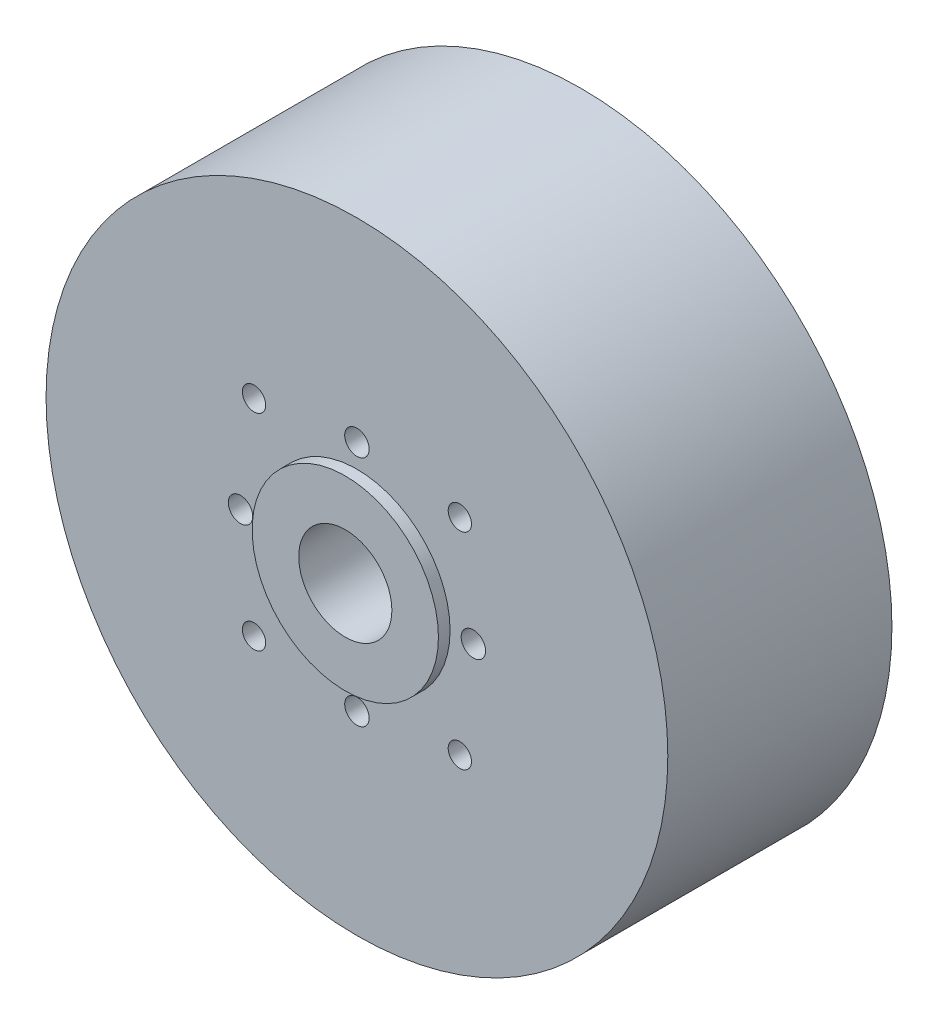
ISO-10303-21;
HEADER;
FILE_DESCRIPTION(('STEP AP214'),'2;1');
FILE_NAME('part.step','',(''),(''),'','','');
FILE_SCHEMA(('AUTOMOTIVE_DESIGN { 1 0 10303 214 1 1 1 1 }'));
ENDSEC;
DATA;
#1=APPLICATION_CONTEXT('core data for automotive mechanical design processes');
#2=APPLICATION_PROTOCOL_DEFINITION('international standard','automotive_design',2000,#1);
#3=PRODUCT_CONTEXT('',#1,'mechanical');
#4=PRODUCT('Part','Part','',(#3));
#5=PRODUCT_RELATED_PRODUCT_CATEGORY('part','',(#4));
#6=PRODUCT_DEFINITION_FORMATION('','',#4);
#7=PRODUCT_DEFINITION_CONTEXT('part definition',#1,'design');
#8=PRODUCT_DEFINITION('design','',#6,#7);
#9=PRODUCT_DEFINITION_SHAPE('','',#8);
#10=(LENGTH_UNIT() NAMED_UNIT(*) SI_UNIT(.MILLI.,.METRE.));
#11=(NAMED_UNIT(*) PLANE_ANGLE_UNIT() SI_UNIT($,.RADIAN.));
#12=(NAMED_UNIT(*) SI_UNIT($,.STERADIAN.) SOLID_ANGLE_UNIT());
#13=UNCERTAINTY_MEASURE_WITH_UNIT(LENGTH_MEASURE(1.E-05),#10,'distance_accuracy_value','');
#14=(GEOMETRIC_REPRESENTATION_CONTEXT(3) GLOBAL_UNCERTAINTY_ASSIGNED_CONTEXT((#13)) GLOBAL_UNIT_ASSIGNED_CONTEXT((#10,
#11,#12)) REPRESENTATION_CONTEXT('',''));
#15=CARTESIAN_POINT('',(0.,0.,0.));
#16=DIRECTION('',(0.,0.,1.));
#17=DIRECTION('',(1.,0.,0.));
#18=AXIS2_PLACEMENT_3D('',#15,#16,#17);
#19=CARTESIAN_POINT('',(0.,0.,0.));
#20=DIRECTION('',(0.,0.,1.));
#21=DIRECTION('',(1.,0.,0.));
#22=AXIS2_PLACEMENT_3D('',#19,#20,#21);
#23=PLANE('',#22);
#24=CARTESIAN_POINT('',(0.,-20.,0.));
#25=DIRECTION('',(0.,0.,1.));
#26=DIRECTION('',(1.,0.,0.));
#27=AXIS2_PLACEMENT_3D('',#24,#25,#26);
#28=CIRCLE('',#27,2.1);
#29=CARTESIAN_POINT('',(2.1,-20.,0.));
#30=VERTEX_POINT('',#29);
#31=EDGE_CURVE('E100',#30,#30,#28,.T.);
#32=ORIENTED_EDGE('',*,*,#31,.F.);
#33=EDGE_LOOP('',(#32));
#34=FACE_BOUND('',#33,.T.);
#35=CARTESIAN_POINT('',(20.,0.,0.));
#36=DIRECTION('',(0.,0.,1.));
#37=DIRECTION('',(1.,0.,0.));
#38=AXIS2_PLACEMENT_3D('',#35,#36,#37);
#39=CIRCLE('',#38,2.1);
#40=CARTESIAN_POINT('',(22.1,0.,0.));
#41=VERTEX_POINT('',#40);
#42=EDGE_CURVE('E97',#41,#41,#39,.T.);
#43=ORIENTED_EDGE('',*,*,#42,.F.);
#44=EDGE_LOOP('',(#43));
#45=FACE_BOUND('',#44,.T.);
#46=CARTESIAN_POINT('',(0.,20.,0.));
#47=DIRECTION('',(0.,0.,1.));
#48=DIRECTION('',(1.,0.,0.));
#49=AXIS2_PLACEMENT_3D('',#46,#47,#48);
#50=CIRCLE('',#49,2.1);
#51=CARTESIAN_POINT('',(2.1,20.,0.));
#52=VERTEX_POINT('',#51);
#53=EDGE_CURVE('E91',#52,#52,#50,.T.);
#54=ORIENTED_EDGE('',*,*,#53,.F.);
#55=EDGE_LOOP('',(#54));
#56=FACE_BOUND('',#55,.T.);
#57=CARTESIAN_POINT('',(-20.,0.,0.));
#58=DIRECTION('',(0.,0.,1.));
#59=DIRECTION('',(1.,0.,0.));
#60=AXIS2_PLACEMENT_3D('',#57,#58,#59);
#61=CIRCLE('',#60,2.1);
#62=CARTESIAN_POINT('',(-17.9,0.,0.));
#63=VERTEX_POINT('',#62);
#64=EDGE_CURVE('E84',#63,#63,#61,.T.);
#65=ORIENTED_EDGE('',*,*,#64,.F.);
#66=EDGE_LOOP('',(#65));
#67=FACE_BOUND('',#66,.T.);
#68=CARTESIAN_POINT('',(0.,0.,0.));
#69=DIRECTION('',(0.,0.,1.));
#70=DIRECTION('',(1.,0.,0.));
#71=AXIS2_PLACEMENT_3D('',#68,#69,#70);
#72=CIRCLE('',#71,53.4);
#73=CARTESIAN_POINT('',(53.4,0.,0.));
#74=VERTEX_POINT('',#73);
#75=EDGE_CURVE('E36',#74,#74,#72,.T.);
#76=ORIENTED_EDGE('',*,*,#75,.T.);
#77=EDGE_LOOP('',(#76));
#78=FACE_BOUND('',#77,.T.);
#79=CARTESIAN_POINT('',(17.6776695296637,-17.6776695296637,0.));
#80=DIRECTION('',(0.,0.,1.));
#81=DIRECTION('',(1.,0.,0.));
#82=AXIS2_PLACEMENT_3D('',#79,#80,#81);
#83=CIRCLE('',#82,2.);
#84=CARTESIAN_POINT('',(19.6776695296637,-17.6776695296637,0.));
#85=VERTEX_POINT('',#84);
#86=EDGE_CURVE('E48',#85,#85,#83,.T.);
#87=ORIENTED_EDGE('',*,*,#86,.F.);
#88=EDGE_LOOP('',(#87));
#89=FACE_BOUND('',#88,.T.);
#90=CARTESIAN_POINT('',(17.6776695296637,17.6776695296637,0.));
#91=DIRECTION('',(0.,0.,1.));
#92=DIRECTION('',(1.,0.,0.));
#93=AXIS2_PLACEMENT_3D('',#90,#91,#92);
#94=CIRCLE('',#93,2.);
#95=CARTESIAN_POINT('',(19.6776695296637,17.6776695296637,0.));
#96=VERTEX_POINT('',#95);
#97=EDGE_CURVE('E51',#96,#96,#94,.T.);
#98=ORIENTED_EDGE('',*,*,#97,.F.);
#99=EDGE_LOOP('',(#98));
#100=FACE_BOUND('',#99,.T.);
#101=CARTESIAN_POINT('',(-17.6776695296638,17.6776695296636,0.));
#102=DIRECTION('',(0.,0.,1.));
#103=DIRECTION('',(1.,0.,0.));
#104=AXIS2_PLACEMENT_3D('',#101,#102,#103);
#105=CIRCLE('',#104,2.00000000000001);
#106=CARTESIAN_POINT('',(-15.6776695296638,17.6776695296636,0.));
#107=VERTEX_POINT('',#106);
#108=EDGE_CURVE('E64',#107,#107,#105,.T.);
#109=ORIENTED_EDGE('',*,*,#108,.F.);
#110=EDGE_LOOP('',(#109));
#111=FACE_BOUND('',#110,.T.);
#112=CARTESIAN_POINT('',(-17.6776695296636,-17.6776695296638,0.));
#113=DIRECTION('',(0.,0.,1.));
#114=DIRECTION('',(1.,0.,0.));
#115=AXIS2_PLACEMENT_3D('',#112,#113,#114);
#116=CIRCLE('',#115,1.99999999999999);
#117=CARTESIAN_POINT('',(-15.6776695296636,-17.6776695296638,0.));
#118=VERTEX_POINT('',#117);
#119=EDGE_CURVE('E57',#118,#118,#116,.T.);
#120=ORIENTED_EDGE('',*,*,#119,.F.);
#121=EDGE_LOOP('',(#120));
#122=FACE_BOUND('',#121,.T.);
#123=CARTESIAN_POINT('',(0.,0.,0.));
#124=DIRECTION('',(0.,0.,1.));
#125=DIRECTION('',(1.,0.,0.));
#126=AXIS2_PLACEMENT_3D('',#123,#124,#125);
#127=CIRCLE('',#126,16.);
#128=CARTESIAN_POINT('',(16.,0.,0.));
#129=VERTEX_POINT('',#128);
#130=EDGE_CURVE('E72',#129,#129,#127,.T.);
#131=ORIENTED_EDGE('',*,*,#130,.F.);
#132=EDGE_LOOP('',(#131));
#133=FACE_BOUND('',#132,.T.);
#134=ADVANCED_FACE('F32',(#34,#45,#56,#67,#78,#89,#100,#111,#122,#133),#23,.T.);
#135=CARTESIAN_POINT('',(0.,0.,-38.5));
#136=DIRECTION('',(0.,0.,1.));
#137=DIRECTION('',(1.,0.,0.));
#138=AXIS2_PLACEMENT_3D('',#135,#136,#137);
#139=CYLINDRICAL_SURFACE('',#138,53.4);
#140=CARTESIAN_POINT('',(0.,0.,-38.5));
#141=DIRECTION('',(0.,0.,1.));
#142=DIRECTION('',(1.,0.,0.));
#143=AXIS2_PLACEMENT_3D('',#140,#141,#142);
#144=CIRCLE('',#143,53.4);
#145=CARTESIAN_POINT('',(53.4,0.,-38.5));
#146=VERTEX_POINT('',#145);
#147=EDGE_CURVE('E10',#146,#146,#144,.T.);
#148=ORIENTED_EDGE('',*,*,#147,.T.);
#149=EDGE_LOOP('',(#148));
#150=FACE_BOUND('',#149,.T.);
#151=ORIENTED_EDGE('',*,*,#75,.F.);
#152=EDGE_LOOP('',(#151));
#153=FACE_BOUND('',#152,.T.);
#154=ADVANCED_FACE('F34',(#150,#153),#139,.T.);
#155=CARTESIAN_POINT('',(0.,0.,-38.5));
#156=DIRECTION('',(0.,0.,1.));
#157=DIRECTION('',(1.,0.,0.));
#158=AXIS2_PLACEMENT_3D('',#155,#156,#157);
#159=PLANE('',#158);
#160=CARTESIAN_POINT('',(30.,0.,-38.5));
#161=DIRECTION('',(0.,0.,-1.));
#162=DIRECTION('',(-1.,0.,0.));
#163=AXIS2_PLACEMENT_3D('',#160,#161,#162);
#164=CIRCLE('',#163,2.5);
#165=CARTESIAN_POINT('',(27.5,0.,-38.5));
#166=VERTEX_POINT('',#165);
#167=EDGE_CURVE('E123',#166,#166,#164,.T.);
#168=ORIENTED_EDGE('',*,*,#167,.F.);
#169=EDGE_LOOP('',(#168));
#170=FACE_BOUND('',#169,.T.);
#171=CARTESIAN_POINT('',(0.,30.,-38.5));
#172=DIRECTION('',(0.,0.,-1.));
#173=DIRECTION('',(-1.,0.,0.));
#174=AXIS2_PLACEMENT_3D('',#171,#172,#173);
#175=CIRCLE('',#174,2.5);
#176=CARTESIAN_POINT('',(-2.5,30.,-38.5));
#177=VERTEX_POINT('',#176);
#178=EDGE_CURVE('E120',#177,#177,#175,.T.);
#179=ORIENTED_EDGE('',*,*,#178,.F.);
#180=EDGE_LOOP('',(#179));
#181=FACE_BOUND('',#180,.T.);
#182=CARTESIAN_POINT('',(-30.,0.,-38.5));
#183=DIRECTION('',(0.,0.,-1.));
#184=DIRECTION('',(-1.,0.,0.));
#185=AXIS2_PLACEMENT_3D('',#182,#183,#184);
#186=CIRCLE('',#185,2.5);
#187=CARTESIAN_POINT('',(-32.5,0.,-38.5));
#188=VERTEX_POINT('',#187);
#189=EDGE_CURVE('E114',#188,#188,#186,.T.);
#190=ORIENTED_EDGE('',*,*,#189,.F.);
#191=EDGE_LOOP('',(#190));
#192=FACE_BOUND('',#191,.T.);
#193=CARTESIAN_POINT('',(0.,-30.,-38.5));
#194=DIRECTION('',(0.,0.,-1.));
#195=DIRECTION('',(-1.,0.,0.));
#196=AXIS2_PLACEMENT_3D('',#193,#194,#195);
#197=CIRCLE('',#196,2.5);
#198=CARTESIAN_POINT('',(-2.5,-30.,-38.5));
#199=VERTEX_POINT('',#198);
#200=EDGE_CURVE('E108',#199,#199,#197,.T.);
#201=ORIENTED_EDGE('',*,*,#200,.F.);
#202=EDGE_LOOP('',(#201));
#203=FACE_BOUND('',#202,.T.);
#204=CARTESIAN_POINT('',(0.,0.,-38.5));
#205=DIRECTION('',(0.,0.,1.));
#206=DIRECTION('',(1.,0.,0.));
#207=AXIS2_PLACEMENT_3D('',#204,#205,#206);
#208=CIRCLE('',#207,8.);
#209=CARTESIAN_POINT('',(8.,0.,-38.5));
#210=VERTEX_POINT('',#209);
#211=EDGE_CURVE('E43',#210,#210,#208,.T.);
#212=ORIENTED_EDGE('',*,*,#211,.T.);
#213=EDGE_LOOP('',(#212));
#214=FACE_BOUND('',#213,.T.);
#215=ORIENTED_EDGE('',*,*,#147,.F.);
#216=EDGE_LOOP('',(#215));
#217=FACE_BOUND('',#216,.T.);
#218=ADVANCED_FACE('F138',(#170,#181,#192,#203,#214,#217),#159,.F.);
#219=CARTESIAN_POINT('',(0.,0.,-38.5));
#220=DIRECTION('',(0.,0.,1.));
#221=DIRECTION('',(1.,0.,0.));
#222=AXIS2_PLACEMENT_3D('',#219,#220,#221);
#223=CYLINDRICAL_SURFACE('',#222,8.);
#224=ORIENTED_EDGE('',*,*,#211,.F.);
#225=EDGE_LOOP('',(#224));
#226=FACE_BOUND('',#225,.T.);
#227=CARTESIAN_POINT('',(0.,0.,2.));
#228=DIRECTION('',(0.,0.,1.));
#229=DIRECTION('',(1.,0.,0.));
#230=AXIS2_PLACEMENT_3D('',#227,#228,#229);
#231=CIRCLE('',#230,8.);
#232=CARTESIAN_POINT('',(8.,0.,2.));
#233=VERTEX_POINT('',#232);
#234=EDGE_CURVE('E75',#233,#233,#231,.T.);
#235=ORIENTED_EDGE('',*,*,#234,.T.);
#236=EDGE_LOOP('',(#235));
#237=FACE_BOUND('',#236,.T.);
#238=ADVANCED_FACE('F141',(#226,#237),#223,.F.);
#239=CARTESIAN_POINT('',(17.6776695296637,-17.6776695296637,-20.));
#240=DIRECTION('',(0.,0.,1.));
#241=DIRECTION('',(1.,0.,0.));
#242=AXIS2_PLACEMENT_3D('',#239,#240,#241);
#243=CYLINDRICAL_SURFACE('',#242,2.);
#244=CARTESIAN_POINT('',(17.6776695296637,-17.6776695296637,-20.));
#245=DIRECTION('',(0.,0.,1.));
#246=DIRECTION('',(1.,0.,0.));
#247=AXIS2_PLACEMENT_3D('',#244,#245,#246);
#248=CIRCLE('',#247,2.);
#249=CARTESIAN_POINT('',(19.6776695296637,-17.6776695296637,-20.));
#250=VERTEX_POINT('',#249);
#251=EDGE_CURVE('E47',#250,#250,#248,.T.);
#252=ORIENTED_EDGE('',*,*,#251,.F.);
#253=EDGE_LOOP('',(#252));
#254=FACE_BOUND('',#253,.T.);
#255=ORIENTED_EDGE('',*,*,#86,.T.);
#256=EDGE_LOOP('',(#255));
#257=FACE_BOUND('',#256,.T.);
#258=ADVANCED_FACE('F154',(#254,#257),#243,.F.);
#259=CARTESIAN_POINT('',(17.6776695296637,-17.6776695296637,-20.));
#260=DIRECTION('',(0.,0.,1.));
#261=DIRECTION('',(1.,0.,0.));
#262=AXIS2_PLACEMENT_3D('',#259,#260,#261);
#263=PLANE('',#262);
#264=ORIENTED_EDGE('',*,*,#251,.T.);
#265=EDGE_LOOP('',(#264));
#266=FACE_BOUND('',#265,.T.);
#267=ADVANCED_FACE('F185',(#266),#263,.T.);
#268=CARTESIAN_POINT('',(17.6776695296637,17.6776695296637,-20.));
#269=DIRECTION('',(0.,0.,1.));
#270=DIRECTION('',(1.,0.,0.));
#271=AXIS2_PLACEMENT_3D('',#268,#269,#270);
#272=CYLINDRICAL_SURFACE('',#271,2.);
#273=CARTESIAN_POINT('',(17.6776695296637,17.6776695296637,-20.));
#274=DIRECTION('',(0.,0.,1.));
#275=DIRECTION('',(1.,0.,0.));
#276=AXIS2_PLACEMENT_3D('',#273,#274,#275);
#277=CIRCLE('',#276,2.);
#278=CARTESIAN_POINT('',(19.6776695296637,17.6776695296637,-20.));
#279=VERTEX_POINT('',#278);
#280=EDGE_CURVE('E67',#279,#279,#277,.T.);
#281=ORIENTED_EDGE('',*,*,#280,.F.);
#282=EDGE_LOOP('',(#281));
#283=FACE_BOUND('',#282,.T.);
#284=ORIENTED_EDGE('',*,*,#97,.T.);
#285=EDGE_LOOP('',(#284));
#286=FACE_BOUND('',#285,.T.);
#287=ADVANCED_FACE('F188',(#283,#286),#272,.F.);
#288=CARTESIAN_POINT('',(17.6776695296637,17.6776695296637,-20.));
#289=DIRECTION('',(0.,0.,1.));
#290=DIRECTION('',(1.,0.,0.));
#291=AXIS2_PLACEMENT_3D('',#288,#289,#290);
#292=PLANE('',#291);
#293=ORIENTED_EDGE('',*,*,#280,.T.);
#294=EDGE_LOOP('',(#293));
#295=FACE_BOUND('',#294,.T.);
#296=ADVANCED_FACE('F201',(#295),#292,.T.);
#297=CARTESIAN_POINT('',(-17.6776695296638,17.6776695296636,-20.));
#298=DIRECTION('',(0.,0.,1.));
#299=DIRECTION('',(1.,0.,0.));
#300=AXIS2_PLACEMENT_3D('',#297,#298,#299);
#301=CYLINDRICAL_SURFACE('',#300,2.00000000000001);
#302=CARTESIAN_POINT('',(-17.6776695296638,17.6776695296636,-20.));
#303=DIRECTION('',(0.,0.,1.));
#304=DIRECTION('',(1.,0.,0.));
#305=AXIS2_PLACEMENT_3D('',#302,#303,#304);
#306=CIRCLE('',#305,2.00000000000001);
#307=CARTESIAN_POINT('',(-15.6776695296638,17.6776695296636,-20.));
#308=VERTEX_POINT('',#307);
#309=EDGE_CURVE('E61',#308,#308,#306,.T.);
#310=ORIENTED_EDGE('',*,*,#309,.F.);
#311=EDGE_LOOP('',(#310));
#312=FACE_BOUND('',#311,.T.);
#313=ORIENTED_EDGE('',*,*,#108,.T.);
#314=EDGE_LOOP('',(#313));
#315=FACE_BOUND('',#314,.T.);
#316=ADVANCED_FACE('F197',(#312,#315),#301,.F.);
#317=CARTESIAN_POINT('',(-17.6776695296638,17.6776695296636,-20.));
#318=DIRECTION('',(0.,0.,1.));
#319=DIRECTION('',(1.,0.,0.));
#320=AXIS2_PLACEMENT_3D('',#317,#318,#319);
#321=PLANE('',#320);
#322=ORIENTED_EDGE('',*,*,#309,.T.);
#323=EDGE_LOOP('',(#322));
#324=FACE_BOUND('',#323,.T.);
#325=ADVANCED_FACE('F193',(#324),#321,.T.);
#326=CARTESIAN_POINT('',(-17.6776695296636,-17.6776695296638,-20.));
#327=DIRECTION('',(0.,0.,1.));
#328=DIRECTION('',(1.,0.,0.));
#329=AXIS2_PLACEMENT_3D('',#326,#327,#328);
#330=CYLINDRICAL_SURFACE('',#329,1.99999999999999);
#331=CARTESIAN_POINT('',(-17.6776695296636,-17.6776695296638,-20.));
#332=DIRECTION('',(0.,0.,1.));
#333=DIRECTION('',(1.,0.,0.));
#334=AXIS2_PLACEMENT_3D('',#331,#332,#333);
#335=CIRCLE('',#334,1.99999999999999);
#336=CARTESIAN_POINT('',(-15.6776695296636,-17.6776695296638,-20.));
#337=VERTEX_POINT('',#336);
#338=EDGE_CURVE('E54',#337,#337,#335,.T.);
#339=ORIENTED_EDGE('',*,*,#338,.F.);
#340=EDGE_LOOP('',(#339));
#341=FACE_BOUND('',#340,.T.);
#342=ORIENTED_EDGE('',*,*,#119,.T.);
#343=EDGE_LOOP('',(#342));
#344=FACE_BOUND('',#343,.T.);
#345=ADVANCED_FACE('F171',(#341,#344),#330,.F.);
#346=CARTESIAN_POINT('',(-17.6776695296636,-17.6776695296638,-20.));
#347=DIRECTION('',(0.,0.,1.));
#348=DIRECTION('',(1.,0.,0.));
#349=AXIS2_PLACEMENT_3D('',#346,#347,#348);
#350=PLANE('',#349);
#351=ORIENTED_EDGE('',*,*,#338,.T.);
#352=EDGE_LOOP('',(#351));
#353=FACE_BOUND('',#352,.T.);
#354=ADVANCED_FACE('F161',(#353),#350,.T.);
#355=CARTESIAN_POINT('',(0.,0.,2.));
#356=DIRECTION('',(0.,0.,1.));
#357=DIRECTION('',(1.,0.,0.));
#358=AXIS2_PLACEMENT_3D('',#355,#356,#357);
#359=PLANE('',#358);
#360=CARTESIAN_POINT('',(0.,0.,2.));
#361=DIRECTION('',(0.,0.,1.));
#362=DIRECTION('',(1.,0.,0.));
#363=AXIS2_PLACEMENT_3D('',#360,#361,#362);
#364=CIRCLE('',#363,16.);
#365=CARTESIAN_POINT('',(16.,0.,2.));
#366=VERTEX_POINT('',#365);
#367=EDGE_CURVE('E58',#366,#366,#364,.T.);
#368=ORIENTED_EDGE('',*,*,#367,.T.);
#369=EDGE_LOOP('',(#368));
#370=FACE_BOUND('',#369,.T.);
#371=ORIENTED_EDGE('',*,*,#234,.F.);
#372=EDGE_LOOP('',(#371));
#373=FACE_BOUND('',#372,.T.);
#374=ADVANCED_FACE('F158',(#370,#373),#359,.T.);
#375=CARTESIAN_POINT('',(0.,0.,2.));
#376=DIRECTION('',(0.,0.,-1.));
#377=DIRECTION('',(-1.,0.,0.));
#378=AXIS2_PLACEMENT_3D('',#375,#376,#377);
#379=CYLINDRICAL_SURFACE('',#378,16.);
#380=ORIENTED_EDGE('',*,*,#367,.F.);
#381=EDGE_LOOP('',(#380));
#382=FACE_BOUND('',#381,.T.);
#383=ORIENTED_EDGE('',*,*,#130,.T.);
#384=EDGE_LOOP('',(#383));
#385=FACE_BOUND('',#384,.T.);
#386=ADVANCED_FACE('F160',(#382,#385),#379,.T.);
#387=CARTESIAN_POINT('',(-20.,0.,-20.));
#388=DIRECTION('',(0.,0.,1.));
#389=DIRECTION('',(1.,0.,0.));
#390=AXIS2_PLACEMENT_3D('',#387,#388,#389);
#391=CYLINDRICAL_SURFACE('',#390,2.1);
#392=CARTESIAN_POINT('',(-20.,0.,-20.));
#393=DIRECTION('',(0.,0.,1.));
#394=DIRECTION('',(1.,0.,0.));
#395=AXIS2_PLACEMENT_3D('',#392,#393,#394);
#396=CIRCLE('',#395,2.1);
#397=CARTESIAN_POINT('',(-17.9,0.,-20.));
#398=VERTEX_POINT('',#397);
#399=EDGE_CURVE('E81',#398,#398,#396,.T.);
#400=ORIENTED_EDGE('',*,*,#399,.F.);
#401=EDGE_LOOP('',(#400));
#402=FACE_BOUND('',#401,.T.);
#403=ORIENTED_EDGE('',*,*,#64,.T.);
#404=EDGE_LOOP('',(#403));
#405=FACE_BOUND('',#404,.T.);
#406=ADVANCED_FACE('F168',(#402,#405),#391,.F.);
#407=CARTESIAN_POINT('',(-20.,0.,-20.));
#408=DIRECTION('',(0.,0.,1.));
#409=DIRECTION('',(1.,0.,0.));
#410=AXIS2_PLACEMENT_3D('',#407,#408,#409);
#411=PLANE('',#410);
#412=ORIENTED_EDGE('',*,*,#399,.T.);
#413=EDGE_LOOP('',(#412));
#414=FACE_BOUND('',#413,.T.);
#415=ADVANCED_FACE('F275',(#414),#411,.T.);
#416=CARTESIAN_POINT('',(0.,20.,-20.));
#417=DIRECTION('',(0.,0.,1.));
#418=DIRECTION('',(1.,0.,0.));
#419=AXIS2_PLACEMENT_3D('',#416,#417,#418);
#420=CYLINDRICAL_SURFACE('',#419,2.1);
#421=CARTESIAN_POINT('',(0.,20.,-20.));
#422=DIRECTION('',(0.,0.,1.));
#423=DIRECTION('',(1.,0.,0.));
#424=AXIS2_PLACEMENT_3D('',#421,#422,#423);
#425=CIRCLE('',#424,2.1);
#426=CARTESIAN_POINT('',(2.1,20.,-20.));
#427=VERTEX_POINT('',#426);
#428=EDGE_CURVE('E88',#427,#427,#425,.T.);
#429=ORIENTED_EDGE('',*,*,#428,.F.);
#430=EDGE_LOOP('',(#429));
#431=FACE_BOUND('',#430,.T.);
#432=ORIENTED_EDGE('',*,*,#53,.T.);
#433=EDGE_LOOP('',(#432));
#434=FACE_BOUND('',#433,.T.);
#435=ADVANCED_FACE('F285',(#431,#434),#420,.F.);
#436=CARTESIAN_POINT('',(0.,20.,-20.));
#437=DIRECTION('',(0.,0.,1.));
#438=DIRECTION('',(1.,0.,0.));
#439=AXIS2_PLACEMENT_3D('',#436,#437,#438);
#440=PLANE('',#439);
#441=ORIENTED_EDGE('',*,*,#428,.T.);
#442=EDGE_LOOP('',(#441));
#443=FACE_BOUND('',#442,.T.);
#444=ADVANCED_FACE('F294',(#443),#440,.T.);
#445=CARTESIAN_POINT('',(20.,0.,-20.));
#446=DIRECTION('',(0.,0.,1.));
#447=DIRECTION('',(1.,0.,0.));
#448=AXIS2_PLACEMENT_3D('',#445,#446,#447);
#449=CYLINDRICAL_SURFACE('',#448,2.1);
#450=CARTESIAN_POINT('',(20.,0.,-20.));
#451=DIRECTION('',(0.,0.,1.));
#452=DIRECTION('',(1.,0.,0.));
#453=AXIS2_PLACEMENT_3D('',#450,#451,#452);
#454=CIRCLE('',#453,2.1);
#455=CARTESIAN_POINT('',(22.1,0.,-20.));
#456=VERTEX_POINT('',#455);
#457=EDGE_CURVE('E94',#456,#456,#454,.T.);
#458=ORIENTED_EDGE('',*,*,#457,.F.);
#459=EDGE_LOOP('',(#458));
#460=FACE_BOUND('',#459,.T.);
#461=ORIENTED_EDGE('',*,*,#42,.T.);
#462=EDGE_LOOP('',(#461));
#463=FACE_BOUND('',#462,.T.);
#464=ADVANCED_FACE('F304',(#460,#463),#449,.F.);
#465=CARTESIAN_POINT('',(20.,0.,-20.));
#466=DIRECTION('',(0.,0.,1.));
#467=DIRECTION('',(1.,0.,0.));
#468=AXIS2_PLACEMENT_3D('',#465,#466,#467);
#469=PLANE('',#468);
#470=ORIENTED_EDGE('',*,*,#457,.T.);
#471=EDGE_LOOP('',(#470));
#472=FACE_BOUND('',#471,.T.);
#473=ADVANCED_FACE('F314',(#472),#469,.T.);
#474=CARTESIAN_POINT('',(0.,-20.,-20.));
#475=DIRECTION('',(0.,0.,1.));
#476=DIRECTION('',(1.,0.,0.));
#477=AXIS2_PLACEMENT_3D('',#474,#475,#476);
#478=CYLINDRICAL_SURFACE('',#477,2.1);
#479=CARTESIAN_POINT('',(0.,-20.,-20.));
#480=DIRECTION('',(0.,0.,1.));
#481=DIRECTION('',(1.,0.,0.));
#482=AXIS2_PLACEMENT_3D('',#479,#480,#481);
#483=CIRCLE('',#482,2.1);
#484=CARTESIAN_POINT('',(2.1,-20.,-20.));
#485=VERTEX_POINT('',#484);
#486=EDGE_CURVE('E80',#485,#485,#483,.T.);
#487=ORIENTED_EDGE('',*,*,#486,.F.);
#488=EDGE_LOOP('',(#487));
#489=FACE_BOUND('',#488,.T.);
#490=ORIENTED_EDGE('',*,*,#31,.T.);
#491=EDGE_LOOP('',(#490));
#492=FACE_BOUND('',#491,.T.);
#493=ADVANCED_FACE('F324',(#489,#492),#478,.F.);
#494=CARTESIAN_POINT('',(0.,-20.,-20.));
#495=DIRECTION('',(0.,0.,1.));
#496=DIRECTION('',(1.,0.,0.));
#497=AXIS2_PLACEMENT_3D('',#494,#495,#496);
#498=PLANE('',#497);
#499=ORIENTED_EDGE('',*,*,#486,.T.);
#500=EDGE_LOOP('',(#499));
#501=FACE_BOUND('',#500,.T.);
#502=ADVANCED_FACE('F334',(#501),#498,.T.);
#503=CARTESIAN_POINT('',(0.,-30.,-18.5));
#504=DIRECTION('',(0.,0.,-1.));
#505=DIRECTION('',(-1.,0.,0.));
#506=AXIS2_PLACEMENT_3D('',#503,#504,#505);
#507=CYLINDRICAL_SURFACE('',#506,2.5);
#508=CARTESIAN_POINT('',(0.,-30.,-18.5));
#509=DIRECTION('',(0.,0.,-1.));
#510=DIRECTION('',(-1.,0.,0.));
#511=AXIS2_PLACEMENT_3D('',#508,#509,#510);
#512=CIRCLE('',#511,2.5);
#513=CARTESIAN_POINT('',(-2.5,-30.,-18.5));
#514=VERTEX_POINT('',#513);
#515=EDGE_CURVE('E105',#514,#514,#512,.T.);
#516=ORIENTED_EDGE('',*,*,#515,.F.);
#517=EDGE_LOOP('',(#516));
#518=FACE_BOUND('',#517,.T.);
#519=ORIENTED_EDGE('',*,*,#200,.T.);
#520=EDGE_LOOP('',(#519));
#521=FACE_BOUND('',#520,.T.);
#522=ADVANCED_FACE('F344',(#518,#521),#507,.F.);
#523=CARTESIAN_POINT('',(0.,-30.,-18.5));
#524=DIRECTION('',(0.,0.,-1.));
#525=DIRECTION('',(-1.,0.,0.));
#526=AXIS2_PLACEMENT_3D('',#523,#524,#525);
#527=PLANE('',#526);
#528=ORIENTED_EDGE('',*,*,#515,.T.);
#529=EDGE_LOOP('',(#528));
#530=FACE_BOUND('',#529,.T.);
#531=ADVANCED_FACE('F361',(#530),#527,.T.);
#532=CARTESIAN_POINT('',(-30.,0.,-18.5));
#533=DIRECTION('',(0.,0.,-1.));
#534=DIRECTION('',(-1.,0.,0.));
#535=AXIS2_PLACEMENT_3D('',#532,#533,#534);
#536=CYLINDRICAL_SURFACE('',#535,2.5);
#537=CARTESIAN_POINT('',(-30.,0.,-18.5));
#538=DIRECTION('',(0.,0.,-1.));
#539=DIRECTION('',(-1.,0.,0.));
#540=AXIS2_PLACEMENT_3D('',#537,#538,#539);
#541=CIRCLE('',#540,2.5);
#542=CARTESIAN_POINT('',(-32.5,0.,-18.5));
#543=VERTEX_POINT('',#542);
#544=EDGE_CURVE('E111',#543,#543,#541,.T.);
#545=ORIENTED_EDGE('',*,*,#544,.F.);
#546=EDGE_LOOP('',(#545));
#547=FACE_BOUND('',#546,.T.);
#548=ORIENTED_EDGE('',*,*,#189,.T.);
#549=EDGE_LOOP('',(#548));
#550=FACE_BOUND('',#549,.T.);
#551=ADVANCED_FACE('F371',(#547,#550),#536,.F.);
#552=CARTESIAN_POINT('',(-30.,0.,-18.5));
#553=DIRECTION('',(0.,0.,-1.));
#554=DIRECTION('',(-1.,0.,0.));
#555=AXIS2_PLACEMENT_3D('',#552,#553,#554);
#556=PLANE('',#555);
#557=ORIENTED_EDGE('',*,*,#544,.T.);
#558=EDGE_LOOP('',(#557));
#559=FACE_BOUND('',#558,.T.);
#560=ADVANCED_FACE('F381',(#559),#556,.T.);
#561=CARTESIAN_POINT('',(0.,30.,-18.5));
#562=DIRECTION('',(0.,0.,-1.));
#563=DIRECTION('',(-1.,0.,0.));
#564=AXIS2_PLACEMENT_3D('',#561,#562,#563);
#565=CYLINDRICAL_SURFACE('',#564,2.5);
#566=CARTESIAN_POINT('',(0.,30.,-18.5));
#567=DIRECTION('',(0.,0.,-1.));
#568=DIRECTION('',(-1.,0.,0.));
#569=AXIS2_PLACEMENT_3D('',#566,#567,#568);
#570=CIRCLE('',#569,2.5);
#571=CARTESIAN_POINT('',(-2.5,30.,-18.5));
#572=VERTEX_POINT('',#571);
#573=EDGE_CURVE('E117',#572,#572,#570,.T.);
#574=ORIENTED_EDGE('',*,*,#573,.F.);
#575=EDGE_LOOP('',(#574));
#576=FACE_BOUND('',#575,.T.);
#577=ORIENTED_EDGE('',*,*,#178,.T.);
#578=EDGE_LOOP('',(#577));
#579=FACE_BOUND('',#578,.T.);
#580=ADVANCED_FACE('F391',(#576,#579),#565,.F.);
#581=CARTESIAN_POINT('',(0.,30.,-18.5));
#582=DIRECTION('',(0.,0.,-1.));
#583=DIRECTION('',(-1.,0.,0.));
#584=AXIS2_PLACEMENT_3D('',#581,#582,#583);
#585=PLANE('',#584);
#586=ORIENTED_EDGE('',*,*,#573,.T.);
#587=EDGE_LOOP('',(#586));
#588=FACE_BOUND('',#587,.T.);
#589=ADVANCED_FACE('F134',(#588),#585,.T.);
#590=CARTESIAN_POINT('',(30.,0.,-18.5));
#591=DIRECTION('',(0.,0.,-1.));
#592=DIRECTION('',(-1.,0.,0.));
#593=AXIS2_PLACEMENT_3D('',#590,#591,#592);
#594=CYLINDRICAL_SURFACE('',#593,2.5);
#595=CARTESIAN_POINT('',(30.,0.,-18.5));
#596=DIRECTION('',(0.,0.,-1.));
#597=DIRECTION('',(-1.,0.,0.));
#598=AXIS2_PLACEMENT_3D('',#595,#596,#597);
#599=CIRCLE('',#598,2.5);
#600=CARTESIAN_POINT('',(27.5,0.,-18.5));
#601=VERTEX_POINT('',#600);
#602=EDGE_CURVE('E85',#601,#601,#599,.T.);
#603=ORIENTED_EDGE('',*,*,#602,.F.);
#604=EDGE_LOOP('',(#603));
#605=FACE_BOUND('',#604,.T.);
#606=ORIENTED_EDGE('',*,*,#167,.T.);
#607=EDGE_LOOP('',(#606));
#608=FACE_BOUND('',#607,.T.);
#609=ADVANCED_FACE('F131',(#605,#608),#594,.F.);
#610=CARTESIAN_POINT('',(30.,0.,-18.5));
#611=DIRECTION('',(0.,0.,-1.));
#612=DIRECTION('',(-1.,0.,0.));
#613=AXIS2_PLACEMENT_3D('',#610,#611,#612);
#614=PLANE('',#613);
#615=ORIENTED_EDGE('',*,*,#602,.T.);
#616=EDGE_LOOP('',(#615));
#617=FACE_BOUND('',#616,.T.);
#618=ADVANCED_FACE('F129',(#617),#614,.T.);
#619=CLOSED_SHELL('',(#134,#154,#218,#238,#258,#267,#287,#296,#316,#325,#345,#354,#374,#386,
#406,#415,#435,#444,#464,#473,#493,#502,#522,#531,#551,#560,#580,#589,#609,#618));
#620=MANIFOLD_SOLID_BREP('B2',#619);
#621=ADVANCED_BREP_SHAPE_REPRESENTATION('',(#18,#620),#14);
#622=SHAPE_DEFINITION_REPRESENTATION(#9,#621);
ENDSEC;
END-ISO-10303-21;
